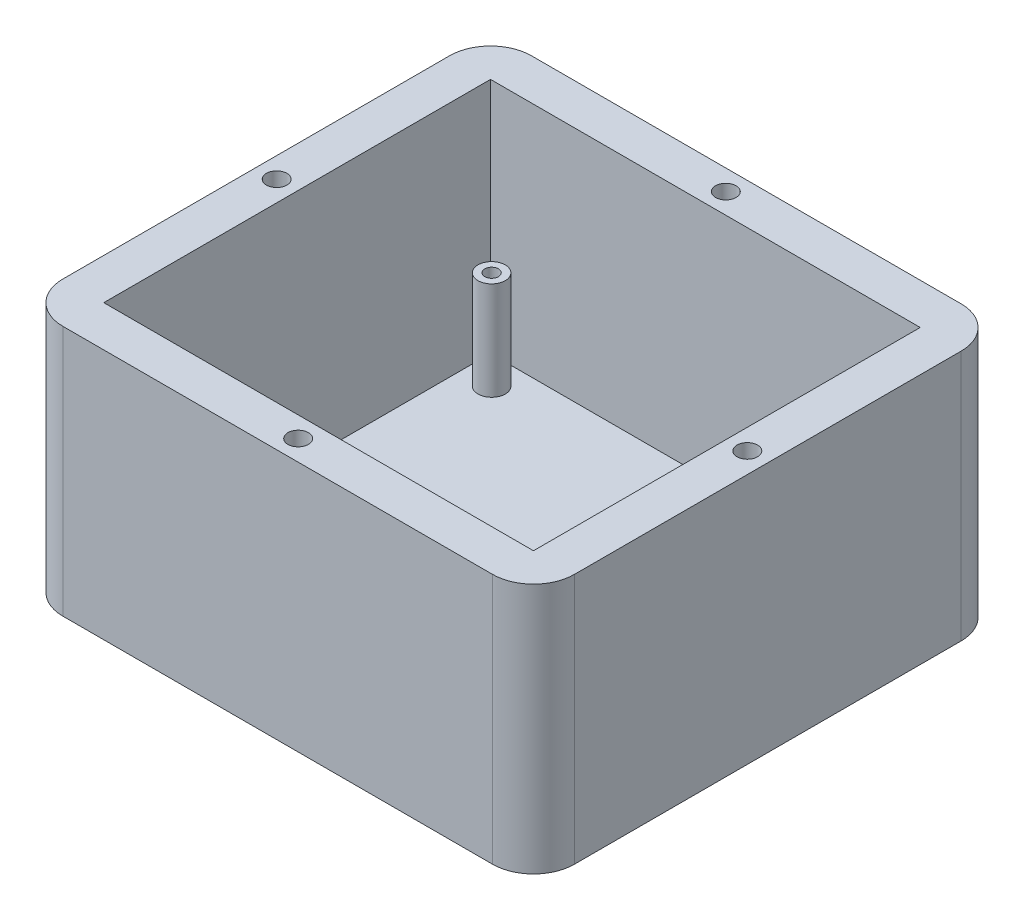
ISO-10303-21;
HEADER;
FILE_DESCRIPTION(('STEP AP214'),'2;1');
FILE_NAME('part.step','',(''),(''),'','','');
FILE_SCHEMA(('AUTOMOTIVE_DESIGN { 1 0 10303 214 1 1 1 1 }'));
ENDSEC;
DATA;
#1=APPLICATION_CONTEXT('core data for automotive mechanical design processes');
#2=APPLICATION_PROTOCOL_DEFINITION('international standard','automotive_design',2000,#1);
#3=PRODUCT_CONTEXT('',#1,'mechanical');
#4=PRODUCT('Part','Part','',(#3));
#5=PRODUCT_RELATED_PRODUCT_CATEGORY('part','',(#4));
#6=PRODUCT_DEFINITION_FORMATION('','',#4);
#7=PRODUCT_DEFINITION_CONTEXT('part definition',#1,'design');
#8=PRODUCT_DEFINITION('design','',#6,#7);
#9=PRODUCT_DEFINITION_SHAPE('','',#8);
#10=(LENGTH_UNIT() NAMED_UNIT(*) SI_UNIT(.MILLI.,.METRE.));
#11=(NAMED_UNIT(*) PLANE_ANGLE_UNIT() SI_UNIT($,.RADIAN.));
#12=(NAMED_UNIT(*) SI_UNIT($,.STERADIAN.) SOLID_ANGLE_UNIT());
#13=UNCERTAINTY_MEASURE_WITH_UNIT(LENGTH_MEASURE(1.E-05),#10,'distance_accuracy_value','');
#14=(GEOMETRIC_REPRESENTATION_CONTEXT(3) GLOBAL_UNCERTAINTY_ASSIGNED_CONTEXT((#13)) GLOBAL_UNIT_ASSIGNED_CONTEXT((#10,
#11,#12)) REPRESENTATION_CONTEXT('',''));
#15=CARTESIAN_POINT('',(0.,0.,0.));
#16=DIRECTION('',(0.,0.,1.));
#17=DIRECTION('',(1.,0.,0.));
#18=AXIS2_PLACEMENT_3D('',#15,#16,#17);
#19=CARTESIAN_POINT('',(3.175,58.42,-93.175000086));
#20=DIRECTION('',(0.,-1.,0.));
#21=DIRECTION('',(0.,0.,-1.));
#22=AXIS2_PLACEMENT_3D('',#19,#20,#21);
#23=PLANE('',#22);
#24=CARTESIAN_POINT('',(-1.5875,58.42,-48.175000043));
#25=DIRECTION('',(0.,1.,0.));
#26=DIRECTION('',(0.,0.,1.));
#27=AXIS2_PLACEMENT_3D('',#24,#25,#26);
#28=CIRCLE('',#27,2.38125);
#29=CARTESIAN_POINT('',(-1.5875,58.42,-45.793750043));
#30=VERTEX_POINT('',#29);
#31=EDGE_CURVE('E154',#30,#30,#28,.T.);
#32=ORIENTED_EDGE('',*,*,#31,.F.);
#33=EDGE_LOOP('',(#32));
#34=FACE_BOUND('',#33,.T.);
#35=CARTESIAN_POINT('',(53.174999949,58.42,-97.937500086));
#36=DIRECTION('',(0.,1.,0.));
#37=DIRECTION('',(0.,0.,1.));
#38=AXIS2_PLACEMENT_3D('',#35,#36,#37);
#39=CIRCLE('',#38,2.38125);
#40=CARTESIAN_POINT('',(53.174999949,58.42,-95.556250086));
#41=VERTEX_POINT('',#40);
#42=EDGE_CURVE('E319',#41,#41,#39,.T.);
#43=ORIENTED_EDGE('',*,*,#42,.F.);
#44=EDGE_LOOP('',(#43));
#45=FACE_BOUND('',#44,.T.);
#46=CARTESIAN_POINT('',(107.937499898,58.42,-48.175000043));
#47=DIRECTION('',(0.,1.,0.));
#48=DIRECTION('',(0.,0.,-1.));
#49=AXIS2_PLACEMENT_3D('',#46,#47,#48);
#50=CIRCLE('',#49,2.38124999999999);
#51=CARTESIAN_POINT('',(107.937499898,58.42,-50.556250043));
#52=VERTEX_POINT('',#51);
#53=EDGE_CURVE('E313',#52,#52,#50,.T.);
#54=ORIENTED_EDGE('',*,*,#53,.F.);
#55=EDGE_LOOP('',(#54));
#56=FACE_BOUND('',#55,.T.);
#57=CARTESIAN_POINT('',(53.174999949,58.42,1.58750000000002));
#58=DIRECTION('',(0.,1.,0.));
#59=DIRECTION('',(0.,0.,-1.));
#60=AXIS2_PLACEMENT_3D('',#57,#58,#59);
#61=CIRCLE('',#60,2.38125);
#62=CARTESIAN_POINT('',(53.174999949,58.42,-0.793749999999979));
#63=VERTEX_POINT('',#62);
#64=EDGE_CURVE('E307',#63,#63,#61,.T.);
#65=ORIENTED_EDGE('',*,*,#64,.F.);
#66=EDGE_LOOP('',(#65));
#67=FACE_BOUND('',#66,.T.);
#68=DIRECTION('',(0.,0.,-1.));
#69=VECTOR('',#68,1.);
#70=CARTESIAN_POINT('',(103.174999898,58.42,-3.175));
#71=LINE('',#70,#69);
#72=CARTESIAN_POINT('',(103.174999898,58.42,-3.175));
#73=VERTEX_POINT('',#72);
#74=CARTESIAN_POINT('',(103.174999898,58.42,-93.175000086));
#75=VERTEX_POINT('',#74);
#76=EDGE_CURVE('E219',#73,#75,#71,.T.);
#77=ORIENTED_EDGE('',*,*,#76,.F.);
#78=DIRECTION('',(1.,0.,0.));
#79=VECTOR('',#78,1.);
#80=CARTESIAN_POINT('',(3.175,58.42,-3.175));
#81=LINE('',#80,#79);
#82=CARTESIAN_POINT('',(3.175,58.42,-3.175));
#83=VERTEX_POINT('',#82);
#84=EDGE_CURVE('E49',#83,#73,#81,.T.);
#85=ORIENTED_EDGE('',*,*,#84,.F.);
#86=DIRECTION('',(0.,0.,1.));
#87=VECTOR('',#86,1.);
#88=CARTESIAN_POINT('',(3.175,58.42,-93.175000086));
#89=LINE('',#88,#87);
#90=CARTESIAN_POINT('',(3.175,58.42,-93.175000086));
#91=VERTEX_POINT('',#90);
#92=EDGE_CURVE('E209',#91,#83,#89,.T.);
#93=ORIENTED_EDGE('',*,*,#92,.F.);
#94=DIRECTION('',(-1.,0.,0.));
#95=VECTOR('',#94,1.);
#96=CARTESIAN_POINT('',(103.174999898,58.42,-93.175000086));
#97=LINE('',#96,#95);
#98=EDGE_CURVE('E222',#75,#91,#97,.T.);
#99=ORIENTED_EDGE('',*,*,#98,.F.);
#100=EDGE_LOOP('',(#77,#85,#93,#99));
#101=FACE_BOUND('',#100,.T.);
#102=CARTESIAN_POINT('',(3.175,58.42,-93.175000086));
#103=DIRECTION('',(0.,-1.,0.));
#104=DIRECTION('',(0.,0.,-1.));
#105=AXIS2_PLACEMENT_3D('',#102,#103,#104);
#106=CIRCLE('',#105,9.525);
#107=CARTESIAN_POINT('',(3.17500000000007,58.42,-102.700000086));
#108=VERTEX_POINT('',#107);
#109=CARTESIAN_POINT('',(-6.35,58.42,-93.1750000859999));
#110=VERTEX_POINT('',#109);
#111=EDGE_CURVE('E134',#108,#110,#106,.F.);
#112=ORIENTED_EDGE('',*,*,#111,.T.);
#113=DIRECTION('',(0.,0.,1.));
#114=VECTOR('',#113,1.);
#115=CARTESIAN_POINT('',(-6.35,58.42,-3.17500000000007));
#116=LINE('',#115,#114);
#117=CARTESIAN_POINT('',(-6.35,58.42,-3.17500000000007));
#118=VERTEX_POINT('',#117);
#119=EDGE_CURVE('E291',#110,#118,#116,.T.);
#120=ORIENTED_EDGE('',*,*,#119,.T.);
#121=CARTESIAN_POINT('',(3.175,58.42,-3.175));
#122=DIRECTION('',(0.,-1.,0.));
#123=DIRECTION('',(0.,0.,-1.));
#124=AXIS2_PLACEMENT_3D('',#121,#122,#123);
#125=CIRCLE('',#124,9.525);
#126=CARTESIAN_POINT('',(3.17500000000003,58.42,6.35));
#127=VERTEX_POINT('',#126);
#128=EDGE_CURVE('E296',#118,#127,#125,.F.);
#129=ORIENTED_EDGE('',*,*,#128,.T.);
#130=DIRECTION('',(1.,0.,0.));
#131=VECTOR('',#130,1.);
#132=CARTESIAN_POINT('',(103.174999898,58.42,6.35));
#133=LINE('',#132,#131);
#134=CARTESIAN_POINT('',(103.174999898,58.42,6.35));
#135=VERTEX_POINT('',#134);
#136=EDGE_CURVE('E297',#127,#135,#133,.T.);
#137=ORIENTED_EDGE('',*,*,#136,.T.);
#138=CARTESIAN_POINT('',(103.174999898,58.42,-3.175));
#139=DIRECTION('',(0.,-1.,0.));
#140=DIRECTION('',(0.,0.,-1.));
#141=AXIS2_PLACEMENT_3D('',#138,#139,#140);
#142=CIRCLE('',#141,9.525);
#143=CARTESIAN_POINT('',(112.699999898,58.42,-3.17500000000003));
#144=VERTEX_POINT('',#143);
#145=EDGE_CURVE('E301',#135,#144,#142,.F.);
#146=ORIENTED_EDGE('',*,*,#145,.T.);
#147=DIRECTION('',(0.,0.,-1.));
#148=VECTOR('',#147,1.);
#149=CARTESIAN_POINT('',(112.699999898,58.42,-93.1750000859999));
#150=LINE('',#149,#148);
#151=CARTESIAN_POINT('',(112.699999898,58.42,-93.1750000859999));
#152=VERTEX_POINT('',#151);
#153=EDGE_CURVE('E303',#144,#152,#150,.T.);
#154=ORIENTED_EDGE('',*,*,#153,.T.);
#155=CARTESIAN_POINT('',(103.174999898,58.42,-93.175000086));
#156=DIRECTION('',(0.,-1.,0.));
#157=DIRECTION('',(0.,0.,-1.));
#158=AXIS2_PLACEMENT_3D('',#155,#156,#157);
#159=CIRCLE('',#158,9.52499999999999);
#160=CARTESIAN_POINT('',(103.174999898,58.4200000000001,-102.700000086));
#161=VERTEX_POINT('',#160);
#162=EDGE_CURVE('E174',#152,#161,#159,.F.);
#163=ORIENTED_EDGE('',*,*,#162,.T.);
#164=DIRECTION('',(-1.,0.,0.));
#165=VECTOR('',#164,1.);
#166=CARTESIAN_POINT('',(3.17500000000007,58.42,-102.700000086));
#167=LINE('',#166,#165);
#168=EDGE_CURVE('E190',#161,#108,#167,.T.);
#169=ORIENTED_EDGE('',*,*,#168,.T.);
#170=EDGE_LOOP('',(#112,#120,#129,#137,#146,#154,#163,#169));
#171=FACE_BOUND('',#170,.T.);
#172=ADVANCED_FACE('F34',(#34,#45,#56,#67,#101,#171),#23,.F.);
#173=CARTESIAN_POINT('',(3.175,3.175,-3.175));
#174=DIRECTION('',(0.,0.,1.));
#175=DIRECTION('',(1.,0.,0.));
#176=AXIS2_PLACEMENT_3D('',#173,#174,#175);
#177=PLANE('',#176);
#178=ORIENTED_EDGE('',*,*,#84,.T.);
#179=DIRECTION('',(0.,1.,0.));
#180=VECTOR('',#179,1.);
#181=CARTESIAN_POINT('',(103.174999898,3.175,-3.175));
#182=LINE('',#181,#180);
#183=CARTESIAN_POINT('',(103.174999898,3.175,-3.175));
#184=VERTEX_POINT('',#183);
#185=EDGE_CURVE('E73',#184,#73,#182,.T.);
#186=ORIENTED_EDGE('',*,*,#185,.F.);
#187=DIRECTION('',(1.,0.,0.));
#188=VECTOR('',#187,1.);
#189=CARTESIAN_POINT('',(3.175,3.175,-3.175));
#190=LINE('',#189,#188);
#191=CARTESIAN_POINT('',(3.175,3.175,-3.175));
#192=VERTEX_POINT('',#191);
#193=EDGE_CURVE('E205',#192,#184,#190,.T.);
#194=ORIENTED_EDGE('',*,*,#193,.F.);
#195=DIRECTION('',(0.,1.,0.));
#196=VECTOR('',#195,1.);
#197=CARTESIAN_POINT('',(3.175,3.175,-3.175));
#198=LINE('',#197,#196);
#199=EDGE_CURVE('E57',#192,#83,#198,.T.);
#200=ORIENTED_EDGE('',*,*,#199,.T.);
#201=EDGE_LOOP('',(#178,#186,#194,#200));
#202=FACE_BOUND('',#201,.T.);
#203=ADVANCED_FACE('F262',(#202),#177,.F.);
#204=CARTESIAN_POINT('',(3.175,3.175,-93.175000086));
#205=DIRECTION('',(-1.,0.,0.));
#206=DIRECTION('',(0.,0.,1.));
#207=AXIS2_PLACEMENT_3D('',#204,#205,#206);
#208=PLANE('',#207);
#209=ORIENTED_EDGE('',*,*,#92,.T.);
#210=ORIENTED_EDGE('',*,*,#199,.F.);
#211=DIRECTION('',(0.,0.,1.));
#212=VECTOR('',#211,1.);
#213=CARTESIAN_POINT('',(3.175,3.175,-93.175000086));
#214=LINE('',#213,#212);
#215=CARTESIAN_POINT('',(3.175,3.175,-93.175000086));
#216=VERTEX_POINT('',#215);
#217=EDGE_CURVE('E215',#216,#192,#214,.T.);
#218=ORIENTED_EDGE('',*,*,#217,.F.);
#219=DIRECTION('',(0.,1.,0.));
#220=VECTOR('',#219,1.);
#221=CARTESIAN_POINT('',(3.175,3.175,-93.175000086));
#222=LINE('',#221,#220);
#223=EDGE_CURVE('E227',#216,#91,#222,.T.);
#224=ORIENTED_EDGE('',*,*,#223,.T.);
#225=EDGE_LOOP('',(#209,#210,#218,#224));
#226=FACE_BOUND('',#225,.T.);
#227=ADVANCED_FACE('F269',(#226),#208,.F.);
#228=CARTESIAN_POINT('',(103.174999898,3.175,-93.175000086));
#229=DIRECTION('',(0.,0.,-1.));
#230=DIRECTION('',(-1.,0.,0.));
#231=AXIS2_PLACEMENT_3D('',#228,#229,#230);
#232=PLANE('',#231);
#233=ORIENTED_EDGE('',*,*,#98,.T.);
#234=ORIENTED_EDGE('',*,*,#223,.F.);
#235=DIRECTION('',(-1.,0.,0.));
#236=VECTOR('',#235,1.);
#237=CARTESIAN_POINT('',(103.174999898,3.175,-93.175000086));
#238=LINE('',#237,#236);
#239=CARTESIAN_POINT('',(103.174999898,3.175,-93.175000086));
#240=VERTEX_POINT('',#239);
#241=EDGE_CURVE('E212',#240,#216,#238,.T.);
#242=ORIENTED_EDGE('',*,*,#241,.F.);
#243=DIRECTION('',(0.,1.,0.));
#244=VECTOR('',#243,1.);
#245=CARTESIAN_POINT('',(103.174999898,3.175,-93.175000086));
#246=LINE('',#245,#244);
#247=EDGE_CURVE('E229',#240,#75,#246,.T.);
#248=ORIENTED_EDGE('',*,*,#247,.T.);
#249=EDGE_LOOP('',(#233,#234,#242,#248));
#250=FACE_BOUND('',#249,.T.);
#251=ADVANCED_FACE('F276',(#250),#232,.F.);
#252=CARTESIAN_POINT('',(103.174999898,3.175,-3.175));
#253=DIRECTION('',(1.,0.,0.));
#254=DIRECTION('',(0.,0.,-1.));
#255=AXIS2_PLACEMENT_3D('',#252,#253,#254);
#256=PLANE('',#255);
#257=ORIENTED_EDGE('',*,*,#76,.T.);
#258=ORIENTED_EDGE('',*,*,#247,.F.);
#259=DIRECTION('',(0.,0.,-1.));
#260=VECTOR('',#259,1.);
#261=CARTESIAN_POINT('',(103.174999898,3.175,-3.175));
#262=LINE('',#261,#260);
#263=EDGE_CURVE('E208',#184,#240,#262,.T.);
#264=ORIENTED_EDGE('',*,*,#263,.F.);
#265=ORIENTED_EDGE('',*,*,#185,.T.);
#266=EDGE_LOOP('',(#257,#258,#264,#265));
#267=FACE_BOUND('',#266,.T.);
#268=ADVANCED_FACE('F256',(#267),#256,.F.);
#269=CARTESIAN_POINT('',(0.,3.175,0.));
#270=DIRECTION('',(0.,1.,0.));
#271=DIRECTION('',(0.,0.,1.));
#272=AXIS2_PLACEMENT_3D('',#269,#270,#271);
#273=PLANE('',#272);
#274=CARTESIAN_POINT('',(9.890999949,3.175,-86.717500043));
#275=DIRECTION('',(0.,1.,0.));
#276=DIRECTION('',(0.,0.,1.));
#277=AXIS2_PLACEMENT_3D('',#274,#275,#276);
#278=CIRCLE('',#277,3.175);
#279=CARTESIAN_POINT('',(9.890999949,3.175,-83.542500043));
#280=VERTEX_POINT('',#279);
#281=EDGE_CURVE('E189',#280,#280,#278,.T.);
#282=ORIENTED_EDGE('',*,*,#281,.F.);
#283=EDGE_LOOP('',(#282));
#284=FACE_BOUND('',#283,.T.);
#285=CARTESIAN_POINT('',(66.303499949,3.175,-10.055000043));
#286=DIRECTION('',(0.,1.,0.));
#287=DIRECTION('',(0.,0.,1.));
#288=AXIS2_PLACEMENT_3D('',#285,#286,#287);
#289=CIRCLE('',#288,3.175);
#290=CARTESIAN_POINT('',(66.303499949,3.175,-6.88000004299999));
#291=VERTEX_POINT('',#290);
#292=EDGE_CURVE('E199',#291,#291,#289,.T.);
#293=ORIENTED_EDGE('',*,*,#292,.F.);
#294=EDGE_LOOP('',(#293));
#295=FACE_BOUND('',#294,.T.);
#296=ORIENTED_EDGE('',*,*,#193,.T.);
#297=ORIENTED_EDGE('',*,*,#263,.T.);
#298=ORIENTED_EDGE('',*,*,#241,.T.);
#299=ORIENTED_EDGE('',*,*,#217,.T.);
#300=EDGE_LOOP('',(#296,#297,#298,#299));
#301=FACE_BOUND('',#300,.T.);
#302=ADVANCED_FACE('F240',(#284,#295,#301),#273,.T.);
#303=CARTESIAN_POINT('',(66.303499949,26.035,-10.055000043));
#304=DIRECTION('',(0.,1.,0.));
#305=DIRECTION('',(0.,0.,1.));
#306=AXIS2_PLACEMENT_3D('',#303,#304,#305);
#307=PLANE('',#306);
#308=CARTESIAN_POINT('',(66.303499949,26.035,-10.055000043));
#309=DIRECTION('',(0.,1.,0.));
#310=DIRECTION('',(0.,0.,1.));
#311=AXIS2_PLACEMENT_3D('',#308,#309,#310);
#312=CIRCLE('',#311,3.175);
#313=CARTESIAN_POINT('',(66.303499949,26.035,-6.88000004299999));
#314=VERTEX_POINT('',#313);
#315=EDGE_CURVE('E200',#314,#314,#312,.T.);
#316=ORIENTED_EDGE('',*,*,#315,.T.);
#317=EDGE_LOOP('',(#316));
#318=FACE_BOUND('',#317,.T.);
#319=CARTESIAN_POINT('',(66.303499949,26.035,-10.055000043));
#320=DIRECTION('',(0.,1.,0.));
#321=DIRECTION('',(0.,0.,1.));
#322=AXIS2_PLACEMENT_3D('',#319,#320,#321);
#323=CIRCLE('',#322,1.5875);
#324=CARTESIAN_POINT('',(66.303499949,26.035,-8.46750004299999));
#325=VERTEX_POINT('',#324);
#326=EDGE_CURVE('E194',#325,#325,#323,.T.);
#327=ORIENTED_EDGE('',*,*,#326,.F.);
#328=EDGE_LOOP('',(#327));
#329=FACE_BOUND('',#328,.T.);
#330=ADVANCED_FACE('F255',(#318,#329),#307,.T.);
#331=CARTESIAN_POINT('',(66.303499949,26.035,-10.055000043));
#332=DIRECTION('',(0.,-1.,0.));
#333=DIRECTION('',(0.,0.,-1.));
#334=AXIS2_PLACEMENT_3D('',#331,#332,#333);
#335=CYLINDRICAL_SURFACE('',#334,3.175);
#336=ORIENTED_EDGE('',*,*,#315,.F.);
#337=EDGE_LOOP('',(#336));
#338=FACE_BOUND('',#337,.T.);
#339=ORIENTED_EDGE('',*,*,#292,.T.);
#340=EDGE_LOOP('',(#339));
#341=FACE_BOUND('',#340,.T.);
#342=ADVANCED_FACE('F249',(#338,#341),#335,.T.);
#343=CARTESIAN_POINT('',(66.303499949,26.035,-10.055000043));
#344=DIRECTION('',(0.,-1.,0.));
#345=DIRECTION('',(0.,0.,-1.));
#346=AXIS2_PLACEMENT_3D('',#343,#344,#345);
#347=CYLINDRICAL_SURFACE('',#346,1.5875);
#348=ORIENTED_EDGE('',*,*,#326,.T.);
#349=EDGE_LOOP('',(#348));
#350=FACE_BOUND('',#349,.T.);
#351=CARTESIAN_POINT('',(66.303499949,3.175,-10.055000043));
#352=DIRECTION('',(0.,1.,0.));
#353=DIRECTION('',(0.,0.,1.));
#354=AXIS2_PLACEMENT_3D('',#351,#352,#353);
#355=CIRCLE('',#354,1.5875);
#356=CARTESIAN_POINT('',(66.303499949,3.175,-8.46750004299999));
#357=VERTEX_POINT('',#356);
#358=EDGE_CURVE('E42',#357,#357,#355,.F.);
#359=ORIENTED_EDGE('',*,*,#358,.T.);
#360=EDGE_LOOP('',(#359));
#361=FACE_BOUND('',#360,.T.);
#362=ADVANCED_FACE('F234',(#350,#361),#347,.F.);
#363=ORIENTED_EDGE('',*,*,#358,.F.);
#364=EDGE_LOOP('',(#363));
#365=FACE_BOUND('',#364,.T.);
#366=ADVANCED_FACE('F236',(#365),#273,.T.);
#367=CARTESIAN_POINT('',(9.890999949,26.035,-86.717500043));
#368=DIRECTION('',(0.,1.,0.));
#369=DIRECTION('',(0.,0.,1.));
#370=AXIS2_PLACEMENT_3D('',#367,#368,#369);
#371=PLANE('',#370);
#372=CARTESIAN_POINT('',(9.890999949,26.035,-86.717500043));
#373=DIRECTION('',(0.,1.,0.));
#374=DIRECTION('',(0.,0.,1.));
#375=AXIS2_PLACEMENT_3D('',#372,#373,#374);
#376=CIRCLE('',#375,3.175);
#377=CARTESIAN_POINT('',(9.890999949,26.035,-83.542500043));
#378=VERTEX_POINT('',#377);
#379=EDGE_CURVE('E191',#378,#378,#376,.T.);
#380=ORIENTED_EDGE('',*,*,#379,.T.);
#381=EDGE_LOOP('',(#380));
#382=FACE_BOUND('',#381,.T.);
#383=CARTESIAN_POINT('',(9.890999949,26.035,-86.717500043));
#384=DIRECTION('',(0.,1.,0.));
#385=DIRECTION('',(0.,0.,1.));
#386=AXIS2_PLACEMENT_3D('',#383,#384,#385);
#387=CIRCLE('',#386,1.5875);
#388=CARTESIAN_POINT('',(9.890999949,26.035,-85.130000043));
#389=VERTEX_POINT('',#388);
#390=EDGE_CURVE('E186',#389,#389,#387,.T.);
#391=ORIENTED_EDGE('',*,*,#390,.F.);
#392=EDGE_LOOP('',(#391));
#393=FACE_BOUND('',#392,.T.);
#394=ADVANCED_FACE('F238',(#382,#393),#371,.T.);
#395=CARTESIAN_POINT('',(9.890999949,26.035,-86.717500043));
#396=DIRECTION('',(0.,-1.,0.));
#397=DIRECTION('',(0.,0.,-1.));
#398=AXIS2_PLACEMENT_3D('',#395,#396,#397);
#399=CYLINDRICAL_SURFACE('',#398,3.175);
#400=ORIENTED_EDGE('',*,*,#379,.F.);
#401=EDGE_LOOP('',(#400));
#402=FACE_BOUND('',#401,.T.);
#403=ORIENTED_EDGE('',*,*,#281,.T.);
#404=EDGE_LOOP('',(#403));
#405=FACE_BOUND('',#404,.T.);
#406=ADVANCED_FACE('F246',(#402,#405),#399,.T.);
#407=CARTESIAN_POINT('',(9.890999949,26.035,-86.717500043));
#408=DIRECTION('',(0.,-1.,0.));
#409=DIRECTION('',(0.,0.,-1.));
#410=AXIS2_PLACEMENT_3D('',#407,#408,#409);
#411=CYLINDRICAL_SURFACE('',#410,1.5875);
#412=ORIENTED_EDGE('',*,*,#390,.T.);
#413=EDGE_LOOP('',(#412));
#414=FACE_BOUND('',#413,.T.);
#415=CARTESIAN_POINT('',(9.890999949,3.175,-86.717500043));
#416=DIRECTION('',(0.,1.,0.));
#417=DIRECTION('',(0.,0.,1.));
#418=AXIS2_PLACEMENT_3D('',#415,#416,#417);
#419=CIRCLE('',#418,1.5875);
#420=CARTESIAN_POINT('',(9.890999949,3.175,-85.130000043));
#421=VERTEX_POINT('',#420);
#422=EDGE_CURVE('E11',#421,#421,#419,.F.);
#423=ORIENTED_EDGE('',*,*,#422,.T.);
#424=EDGE_LOOP('',(#423));
#425=FACE_BOUND('',#424,.T.);
#426=ADVANCED_FACE('F259',(#414,#425),#411,.F.);
#427=ORIENTED_EDGE('',*,*,#422,.F.);
#428=EDGE_LOOP('',(#427));
#429=FACE_BOUND('',#428,.T.);
#430=ADVANCED_FACE('F241',(#429),#273,.T.);
#431=CARTESIAN_POINT('',(3.17500000000007,219.865981660958,-102.700000086));
#432=DIRECTION('',(0.,0.,-1.));
#433=DIRECTION('',(-1.,0.,0.));
#434=AXIS2_PLACEMENT_3D('',#431,#432,#433);
#435=PLANE('',#434);
#436=ORIENTED_EDGE('',*,*,#168,.F.);
#437=DIRECTION('',(0.,-1.,0.));
#438=VECTOR('',#437,1.);
#439=CARTESIAN_POINT('',(103.174999898,219.865981660958,-102.700000086));
#440=LINE('',#439,#438);
#441=CARTESIAN_POINT('',(103.174999898,0.,-102.700000086));
#442=VERTEX_POINT('',#441);
#443=EDGE_CURVE('E137',#161,#442,#440,.T.);
#444=ORIENTED_EDGE('',*,*,#443,.T.);
#445=DIRECTION('',(1.,0.,0.));
#446=VECTOR('',#445,1.);
#447=CARTESIAN_POINT('',(3.17500000000007,0.,-102.700000086));
#448=LINE('',#447,#446);
#449=CARTESIAN_POINT('',(3.17500000000007,0.,-102.700000086));
#450=VERTEX_POINT('',#449);
#451=EDGE_CURVE('E141',#450,#442,#448,.T.);
#452=ORIENTED_EDGE('',*,*,#451,.F.);
#453=DIRECTION('',(0.,-1.,0.));
#454=VECTOR('',#453,1.);
#455=CARTESIAN_POINT('',(3.17500000000007,219.865981660958,-102.700000086));
#456=LINE('',#455,#454);
#457=EDGE_CURVE('E127',#108,#450,#456,.T.);
#458=ORIENTED_EDGE('',*,*,#457,.F.);
#459=EDGE_LOOP('',(#436,#444,#452,#458));
#460=FACE_BOUND('',#459,.T.);
#461=ADVANCED_FACE('F142',(#460),#435,.T.);
#462=CARTESIAN_POINT('',(103.174999898,219.865981660958,-93.175000086));
#463=DIRECTION('',(0.,-1.,0.));
#464=DIRECTION('',(0.,0.,-1.));
#465=AXIS2_PLACEMENT_3D('',#462,#463,#464);
#466=CYLINDRICAL_SURFACE('',#465,9.52499999999999);
#467=ORIENTED_EDGE('',*,*,#162,.F.);
#468=DIRECTION('',(0.,-1.,0.));
#469=VECTOR('',#468,1.);
#470=CARTESIAN_POINT('',(112.699999898,219.865981660958,-93.1750000859999));
#471=LINE('',#470,#469);
#472=CARTESIAN_POINT('',(112.699999898,0.,-93.1750000859999));
#473=VERTEX_POINT('',#472);
#474=EDGE_CURVE('E183',#152,#473,#471,.T.);
#475=ORIENTED_EDGE('',*,*,#474,.T.);
#476=CARTESIAN_POINT('',(103.174999898,0.,-93.175000086));
#477=DIRECTION('',(0.,-1.,0.));
#478=DIRECTION('',(0.,0.,-1.));
#479=AXIS2_PLACEMENT_3D('',#476,#477,#478);
#480=CIRCLE('',#479,9.52499999999999);
#481=EDGE_CURVE('E147',#442,#473,#480,.T.);
#482=ORIENTED_EDGE('',*,*,#481,.F.);
#483=ORIENTED_EDGE('',*,*,#443,.F.);
#484=EDGE_LOOP('',(#467,#475,#482,#483));
#485=FACE_BOUND('',#484,.T.);
#486=ADVANCED_FACE('F380',(#485),#466,.T.);
#487=CARTESIAN_POINT('',(112.699999898,219.865981660958,-93.1750000859999));
#488=DIRECTION('',(1.,0.,0.));
#489=DIRECTION('',(0.,0.,-1.));
#490=AXIS2_PLACEMENT_3D('',#487,#488,#489);
#491=PLANE('',#490);
#492=ORIENTED_EDGE('',*,*,#153,.F.);
#493=DIRECTION('',(0.,-1.,0.));
#494=VECTOR('',#493,1.);
#495=CARTESIAN_POINT('',(112.699999898,219.865981660958,-3.17500000000003));
#496=LINE('',#495,#494);
#497=CARTESIAN_POINT('',(112.699999898,0.,-3.17500000000003));
#498=VERTEX_POINT('',#497);
#499=EDGE_CURVE('E181',#144,#498,#496,.T.);
#500=ORIENTED_EDGE('',*,*,#499,.T.);
#501=DIRECTION('',(0.,0.,1.));
#502=VECTOR('',#501,1.);
#503=CARTESIAN_POINT('',(112.699999898,0.,-93.1750000859999));
#504=LINE('',#503,#502);
#505=EDGE_CURVE('E160',#473,#498,#504,.T.);
#506=ORIENTED_EDGE('',*,*,#505,.F.);
#507=ORIENTED_EDGE('',*,*,#474,.F.);
#508=EDGE_LOOP('',(#492,#500,#506,#507));
#509=FACE_BOUND('',#508,.T.);
#510=ADVANCED_FACE('F376',(#509),#491,.T.);
#511=CARTESIAN_POINT('',(103.174999898,219.865981660958,-3.175));
#512=DIRECTION('',(0.,-1.,0.));
#513=DIRECTION('',(0.,0.,-1.));
#514=AXIS2_PLACEMENT_3D('',#511,#512,#513);
#515=CYLINDRICAL_SURFACE('',#514,9.525);
#516=ORIENTED_EDGE('',*,*,#145,.F.);
#517=DIRECTION('',(0.,-1.,0.));
#518=VECTOR('',#517,1.);
#519=CARTESIAN_POINT('',(103.174999898,219.865981660958,6.35));
#520=LINE('',#519,#518);
#521=CARTESIAN_POINT('',(103.174999898,0.,6.35));
#522=VERTEX_POINT('',#521);
#523=EDGE_CURVE('E179',#135,#522,#520,.T.);
#524=ORIENTED_EDGE('',*,*,#523,.T.);
#525=CARTESIAN_POINT('',(103.174999898,0.,-3.175));
#526=DIRECTION('',(0.,-1.,0.));
#527=DIRECTION('',(0.,0.,-1.));
#528=AXIS2_PLACEMENT_3D('',#525,#526,#527);
#529=CIRCLE('',#528,9.525);
#530=EDGE_CURVE('E163',#498,#522,#529,.T.);
#531=ORIENTED_EDGE('',*,*,#530,.F.);
#532=ORIENTED_EDGE('',*,*,#499,.F.);
#533=EDGE_LOOP('',(#516,#524,#531,#532));
#534=FACE_BOUND('',#533,.T.);
#535=ADVANCED_FACE('F372',(#534),#515,.T.);
#536=CARTESIAN_POINT('',(103.174999898,219.865981660958,6.35));
#537=DIRECTION('',(0.,0.,1.));
#538=DIRECTION('',(1.,0.,0.));
#539=AXIS2_PLACEMENT_3D('',#536,#537,#538);
#540=PLANE('',#539);
#541=ORIENTED_EDGE('',*,*,#136,.F.);
#542=DIRECTION('',(0.,-1.,0.));
#543=VECTOR('',#542,1.);
#544=CARTESIAN_POINT('',(3.17500000000003,219.865981660958,6.35));
#545=LINE('',#544,#543);
#546=CARTESIAN_POINT('',(3.17500000000003,0.,6.35));
#547=VERTEX_POINT('',#546);
#548=EDGE_CURVE('E177',#127,#547,#545,.T.);
#549=ORIENTED_EDGE('',*,*,#548,.T.);
#550=DIRECTION('',(-1.,0.,0.));
#551=VECTOR('',#550,1.);
#552=CARTESIAN_POINT('',(103.174999898,0.,6.35));
#553=LINE('',#552,#551);
#554=EDGE_CURVE('E166',#522,#547,#553,.T.);
#555=ORIENTED_EDGE('',*,*,#554,.F.);
#556=ORIENTED_EDGE('',*,*,#523,.F.);
#557=EDGE_LOOP('',(#541,#549,#555,#556));
#558=FACE_BOUND('',#557,.T.);
#559=ADVANCED_FACE('F368',(#558),#540,.T.);
#560=CARTESIAN_POINT('',(3.175,219.865981660958,-3.175));
#561=DIRECTION('',(0.,-1.,0.));
#562=DIRECTION('',(0.,0.,-1.));
#563=AXIS2_PLACEMENT_3D('',#560,#561,#562);
#564=CYLINDRICAL_SURFACE('',#563,9.525);
#565=ORIENTED_EDGE('',*,*,#128,.F.);
#566=DIRECTION('',(0.,-1.,0.));
#567=VECTOR('',#566,1.);
#568=CARTESIAN_POINT('',(-6.35,219.865981660958,-3.17500000000007));
#569=LINE('',#568,#567);
#570=CARTESIAN_POINT('',(-6.35,0.,-3.17500000000007));
#571=VERTEX_POINT('',#570);
#572=EDGE_CURVE('E175',#118,#571,#569,.T.);
#573=ORIENTED_EDGE('',*,*,#572,.T.);
#574=CARTESIAN_POINT('',(3.175,0.,-3.175));
#575=DIRECTION('',(0.,-1.,0.));
#576=DIRECTION('',(0.,0.,-1.));
#577=AXIS2_PLACEMENT_3D('',#574,#575,#576);
#578=CIRCLE('',#577,9.525);
#579=EDGE_CURVE('E169',#547,#571,#578,.T.);
#580=ORIENTED_EDGE('',*,*,#579,.F.);
#581=ORIENTED_EDGE('',*,*,#548,.F.);
#582=EDGE_LOOP('',(#565,#573,#580,#581));
#583=FACE_BOUND('',#582,.T.);
#584=ADVANCED_FACE('F365',(#583),#564,.T.);
#585=CARTESIAN_POINT('',(-6.35,219.865981660958,-3.17500000000007));
#586=DIRECTION('',(-1.,0.,0.));
#587=DIRECTION('',(0.,0.,1.));
#588=AXIS2_PLACEMENT_3D('',#585,#586,#587);
#589=PLANE('',#588);
#590=ORIENTED_EDGE('',*,*,#119,.F.);
#591=DIRECTION('',(0.,-1.,0.));
#592=VECTOR('',#591,1.);
#593=CARTESIAN_POINT('',(-6.35,219.865981660958,-93.1750000859999));
#594=LINE('',#593,#592);
#595=CARTESIAN_POINT('',(-6.35,0.,-93.1750000859999));
#596=VERTEX_POINT('',#595);
#597=EDGE_CURVE('E172',#110,#596,#594,.T.);
#598=ORIENTED_EDGE('',*,*,#597,.T.);
#599=DIRECTION('',(0.,0.,-1.));
#600=VECTOR('',#599,1.);
#601=CARTESIAN_POINT('',(-6.35,0.,-3.17500000000007));
#602=LINE('',#601,#600);
#603=EDGE_CURVE('E138',#571,#596,#602,.T.);
#604=ORIENTED_EDGE('',*,*,#603,.F.);
#605=ORIENTED_EDGE('',*,*,#572,.F.);
#606=EDGE_LOOP('',(#590,#598,#604,#605));
#607=FACE_BOUND('',#606,.T.);
#608=ADVANCED_FACE('F295',(#607),#589,.T.);
#609=CARTESIAN_POINT('',(3.175,219.865981660958,-93.175000086));
#610=DIRECTION('',(0.,-1.,0.));
#611=DIRECTION('',(0.,0.,-1.));
#612=AXIS2_PLACEMENT_3D('',#609,#610,#611);
#613=CYLINDRICAL_SURFACE('',#612,9.525);
#614=ORIENTED_EDGE('',*,*,#111,.F.);
#615=ORIENTED_EDGE('',*,*,#457,.T.);
#616=CARTESIAN_POINT('',(3.175,0.,-93.175000086));
#617=DIRECTION('',(0.,-1.,0.));
#618=DIRECTION('',(0.,0.,-1.));
#619=AXIS2_PLACEMENT_3D('',#616,#617,#618);
#620=CIRCLE('',#619,9.525);
#621=EDGE_CURVE('E132',#596,#450,#620,.T.);
#622=ORIENTED_EDGE('',*,*,#621,.F.);
#623=ORIENTED_EDGE('',*,*,#597,.F.);
#624=EDGE_LOOP('',(#614,#615,#622,#623));
#625=FACE_BOUND('',#624,.T.);
#626=ADVANCED_FACE('F129',(#625),#613,.T.);
#627=CARTESIAN_POINT('',(3.175,0.,-93.175000086));
#628=DIRECTION('',(0.,-1.,0.));
#629=DIRECTION('',(0.,0.,-1.));
#630=AXIS2_PLACEMENT_3D('',#627,#628,#629);
#631=PLANE('',#630);
#632=ORIENTED_EDGE('',*,*,#621,.T.);
#633=ORIENTED_EDGE('',*,*,#451,.T.);
#634=ORIENTED_EDGE('',*,*,#481,.T.);
#635=ORIENTED_EDGE('',*,*,#505,.T.);
#636=ORIENTED_EDGE('',*,*,#530,.T.);
#637=ORIENTED_EDGE('',*,*,#554,.T.);
#638=ORIENTED_EDGE('',*,*,#579,.T.);
#639=ORIENTED_EDGE('',*,*,#603,.T.);
#640=EDGE_LOOP('',(#632,#633,#634,#635,#636,#637,#638,#639));
#641=FACE_BOUND('',#640,.T.);
#642=ADVANCED_FACE('F36',(#641),#631,.T.);
#643=CARTESIAN_POINT('',(53.174999949,45.72,1.58750000000002));
#644=DIRECTION('',(0.,1.,0.));
#645=DIRECTION('',(0.,0.,1.));
#646=AXIS2_PLACEMENT_3D('',#643,#644,#645);
#647=CYLINDRICAL_SURFACE('',#646,2.38125);
#648=CARTESIAN_POINT('',(53.174999949,45.72,1.58750000000002));
#649=DIRECTION('',(0.,1.,0.));
#650=DIRECTION('',(0.,0.,-1.));
#651=AXIS2_PLACEMENT_3D('',#648,#649,#650);
#652=CIRCLE('',#651,2.38125);
#653=CARTESIAN_POINT('',(53.174999949,45.72,-0.793749999999979));
#654=VERTEX_POINT('',#653);
#655=EDGE_CURVE('E310',#654,#654,#652,.T.);
#656=ORIENTED_EDGE('',*,*,#655,.F.);
#657=EDGE_LOOP('',(#656));
#658=FACE_BOUND('',#657,.T.);
#659=ORIENTED_EDGE('',*,*,#64,.T.);
#660=EDGE_LOOP('',(#659));
#661=FACE_BOUND('',#660,.T.);
#662=ADVANCED_FACE('F358',(#658,#661),#647,.F.);
#663=CARTESIAN_POINT('',(53.174999949,45.72,1.58750000000002));
#664=DIRECTION('',(0.,-1.,0.));
#665=DIRECTION('',(0.,0.,-1.));
#666=AXIS2_PLACEMENT_3D('',#663,#664,#665);
#667=PLANE('',#666);
#668=ORIENTED_EDGE('',*,*,#655,.T.);
#669=EDGE_LOOP('',(#668));
#670=FACE_BOUND('',#669,.T.);
#671=ADVANCED_FACE('F354',(#670),#667,.F.);
#672=CARTESIAN_POINT('',(107.937499898,45.72,-48.175000043));
#673=DIRECTION('',(0.,1.,0.));
#674=DIRECTION('',(0.,0.,1.));
#675=AXIS2_PLACEMENT_3D('',#672,#673,#674);
#676=CYLINDRICAL_SURFACE('',#675,2.38124999999999);
#677=CARTESIAN_POINT('',(107.937499898,45.72,-48.175000043));
#678=DIRECTION('',(0.,1.,0.));
#679=DIRECTION('',(0.,0.,-1.));
#680=AXIS2_PLACEMENT_3D('',#677,#678,#679);
#681=CIRCLE('',#680,2.38124999999999);
#682=CARTESIAN_POINT('',(107.937499898,45.72,-50.556250043));
#683=VERTEX_POINT('',#682);
#684=EDGE_CURVE('E316',#683,#683,#681,.T.);
#685=ORIENTED_EDGE('',*,*,#684,.F.);
#686=EDGE_LOOP('',(#685));
#687=FACE_BOUND('',#686,.T.);
#688=ORIENTED_EDGE('',*,*,#53,.T.);
#689=EDGE_LOOP('',(#688));
#690=FACE_BOUND('',#689,.T.);
#691=ADVANCED_FACE('F350',(#687,#690),#676,.F.);
#692=CARTESIAN_POINT('',(107.937499898,45.72,-48.175000043));
#693=DIRECTION('',(0.,-1.,0.));
#694=DIRECTION('',(0.,0.,-1.));
#695=AXIS2_PLACEMENT_3D('',#692,#693,#694);
#696=PLANE('',#695);
#697=ORIENTED_EDGE('',*,*,#684,.T.);
#698=EDGE_LOOP('',(#697));
#699=FACE_BOUND('',#698,.T.);
#700=ADVANCED_FACE('F346',(#699),#696,.F.);
#701=CARTESIAN_POINT('',(53.174999949,45.72,-97.937500086));
#702=DIRECTION('',(0.,1.,0.));
#703=DIRECTION('',(0.,0.,1.));
#704=AXIS2_PLACEMENT_3D('',#701,#702,#703);
#705=CYLINDRICAL_SURFACE('',#704,2.38125);
#706=CARTESIAN_POINT('',(53.174999949,45.72,-97.937500086));
#707=DIRECTION('',(0.,1.,0.));
#708=DIRECTION('',(0.,0.,1.));
#709=AXIS2_PLACEMENT_3D('',#706,#707,#708);
#710=CIRCLE('',#709,2.38125);
#711=CARTESIAN_POINT('',(53.174999949,45.72,-95.556250086));
#712=VERTEX_POINT('',#711);
#713=EDGE_CURVE('E322',#712,#712,#710,.T.);
#714=ORIENTED_EDGE('',*,*,#713,.F.);
#715=EDGE_LOOP('',(#714));
#716=FACE_BOUND('',#715,.T.);
#717=ORIENTED_EDGE('',*,*,#42,.T.);
#718=EDGE_LOOP('',(#717));
#719=FACE_BOUND('',#718,.T.);
#720=ADVANCED_FACE('F339',(#716,#719),#705,.F.);
#721=CARTESIAN_POINT('',(53.174999949,45.72,-97.937500086));
#722=DIRECTION('',(0.,1.,0.));
#723=DIRECTION('',(0.,0.,1.));
#724=AXIS2_PLACEMENT_3D('',#721,#722,#723);
#725=PLANE('',#724);
#726=ORIENTED_EDGE('',*,*,#713,.T.);
#727=EDGE_LOOP('',(#726));
#728=FACE_BOUND('',#727,.T.);
#729=ADVANCED_FACE('F330',(#728),#725,.T.);
#730=CARTESIAN_POINT('',(-1.5875,45.72,-48.175000043));
#731=DIRECTION('',(0.,1.,0.));
#732=DIRECTION('',(0.,0.,1.));
#733=AXIS2_PLACEMENT_3D('',#730,#731,#732);
#734=CYLINDRICAL_SURFACE('',#733,2.38125);
#735=CARTESIAN_POINT('',(-1.5875,45.72,-48.175000043));
#736=DIRECTION('',(0.,1.,0.));
#737=DIRECTION('',(0.,0.,1.));
#738=AXIS2_PLACEMENT_3D('',#735,#736,#737);
#739=CIRCLE('',#738,2.38125);
#740=CARTESIAN_POINT('',(-1.5875,45.72,-45.793750043));
#741=VERTEX_POINT('',#740);
#742=EDGE_CURVE('E151',#741,#741,#739,.T.);
#743=ORIENTED_EDGE('',*,*,#742,.F.);
#744=EDGE_LOOP('',(#743));
#745=FACE_BOUND('',#744,.T.);
#746=ORIENTED_EDGE('',*,*,#31,.T.);
#747=EDGE_LOOP('',(#746));
#748=FACE_BOUND('',#747,.T.);
#749=ADVANCED_FACE('F327',(#745,#748),#734,.F.);
#750=CARTESIAN_POINT('',(-1.5875,45.72,-48.175000043));
#751=DIRECTION('',(0.,1.,0.));
#752=DIRECTION('',(0.,0.,1.));
#753=AXIS2_PLACEMENT_3D('',#750,#751,#752);
#754=PLANE('',#753);
#755=ORIENTED_EDGE('',*,*,#742,.T.);
#756=EDGE_LOOP('',(#755));
#757=FACE_BOUND('',#756,.T.);
#758=ADVANCED_FACE('F329',(#757),#754,.T.);
#759=CLOSED_SHELL('',(#172,#203,#227,#251,#268,#302,#330,#342,#362,#366,#394,#406,#426,#430,
#461,#486,#510,#535,#559,#584,#608,#626,#642,#662,#671,#691,#700,#720,#729,#749,#758));
#760=MANIFOLD_SOLID_BREP('B2',#759);
#761=ADVANCED_BREP_SHAPE_REPRESENTATION('',(#18,#760),#14);
#762=SHAPE_DEFINITION_REPRESENTATION(#9,#761);
ENDSEC;
END-ISO-10303-21;
